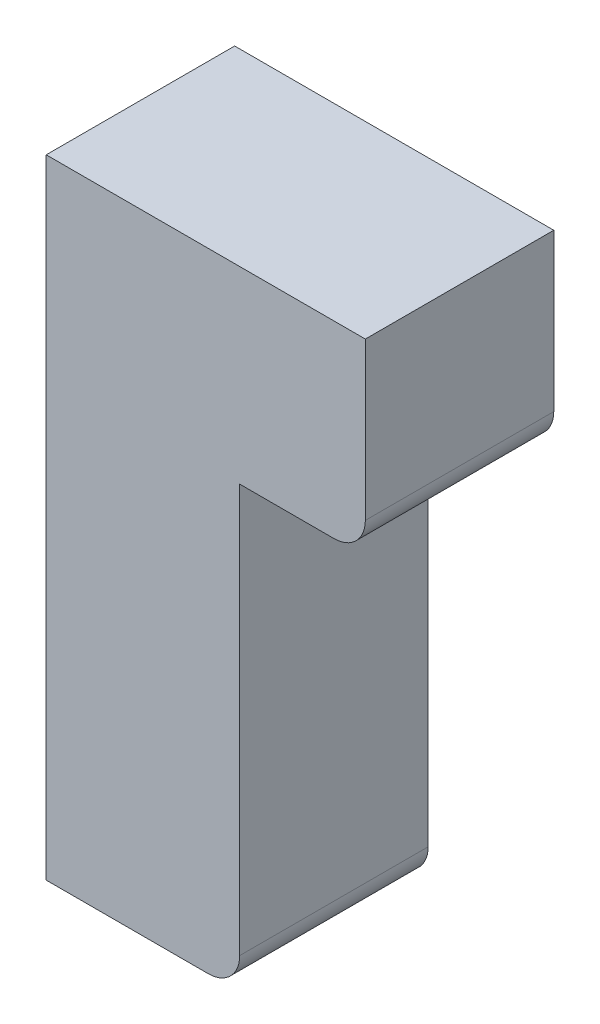
ISO-10303-21;
HEADER;
FILE_DESCRIPTION(('STEP AP214'),'2;1');
FILE_NAME('part.step','',(''),(''),'','','');
FILE_SCHEMA(('AUTOMOTIVE_DESIGN { 1 0 10303 214 1 1 1 1 }'));
ENDSEC;
DATA;
#1=APPLICATION_CONTEXT('core data for automotive mechanical design processes');
#2=APPLICATION_PROTOCOL_DEFINITION('international standard','automotive_design',2000,#1);
#3=PRODUCT_CONTEXT('',#1,'mechanical');
#4=PRODUCT('Part','Part','',(#3));
#5=PRODUCT_RELATED_PRODUCT_CATEGORY('part','',(#4));
#6=PRODUCT_DEFINITION_FORMATION('','',#4);
#7=PRODUCT_DEFINITION_CONTEXT('part definition',#1,'design');
#8=PRODUCT_DEFINITION('design','',#6,#7);
#9=PRODUCT_DEFINITION_SHAPE('','',#8);
#10=(LENGTH_UNIT() NAMED_UNIT(*) SI_UNIT(.MILLI.,.METRE.));
#11=(NAMED_UNIT(*) PLANE_ANGLE_UNIT() SI_UNIT($,.RADIAN.));
#12=(NAMED_UNIT(*) SI_UNIT($,.STERADIAN.) SOLID_ANGLE_UNIT());
#13=UNCERTAINTY_MEASURE_WITH_UNIT(LENGTH_MEASURE(1.E-05),#10,'distance_accuracy_value','');
#14=(GEOMETRIC_REPRESENTATION_CONTEXT(3) GLOBAL_UNCERTAINTY_ASSIGNED_CONTEXT((#13)) GLOBAL_UNIT_ASSIGNED_CONTEXT((#10,
#11,#12)) REPRESENTATION_CONTEXT('',''));
#15=CARTESIAN_POINT('',(0.,0.,0.));
#16=DIRECTION('',(0.,0.,1.));
#17=DIRECTION('',(1.,0.,0.));
#18=AXIS2_PLACEMENT_3D('',#15,#16,#17);
#19=CARTESIAN_POINT('',(-6.44521056215637,-2.8608374283638,3.));
#20=DIRECTION('',(1.,0.,0.));
#21=DIRECTION('',(0.,0.,-1.));
#22=AXIS2_PLACEMENT_3D('',#19,#20,#21);
#23=PLANE('',#22);
#24=DIRECTION('',(0.,-1.,0.));
#25=VECTOR('',#24,1.);
#26=CARTESIAN_POINT('',(-6.44521056215637,-2.8608374283638,0.));
#27=LINE('',#26,#25);
#28=CARTESIAN_POINT('',(-6.44521056215637,7.1391625716362,0.));
#29=VERTEX_POINT('',#28);
#30=CARTESIAN_POINT('',(-6.44521056215637,-2.8608374283638,0.));
#31=VERTEX_POINT('',#30);
#32=EDGE_CURVE('E122',#29,#31,#27,.T.);
#33=ORIENTED_EDGE('',*,*,#32,.T.);
#34=DIRECTION('',(0.,0.,-1.));
#35=VECTOR('',#34,1.);
#36=CARTESIAN_POINT('',(-6.44521056215637,-2.8608374283638,3.));
#37=LINE('',#36,#35);
#38=CARTESIAN_POINT('',(-6.44521056215637,-2.8608374283638,3.));
#39=VERTEX_POINT('',#38);
#40=EDGE_CURVE('E103',#39,#31,#37,.T.);
#41=ORIENTED_EDGE('',*,*,#40,.F.);
#42=DIRECTION('',(0.,-1.,0.));
#43=VECTOR('',#42,1.);
#44=CARTESIAN_POINT('',(-6.44521056215637,-2.8608374283638,3.));
#45=LINE('',#44,#43);
#46=CARTESIAN_POINT('',(-6.44521056215637,7.1391625716362,3.));
#47=VERTEX_POINT('',#46);
#48=EDGE_CURVE('E110',#47,#39,#45,.T.);
#49=ORIENTED_EDGE('',*,*,#48,.F.);
#50=DIRECTION('',(0.,0.,-1.));
#51=VECTOR('',#50,1.);
#52=CARTESIAN_POINT('',(-6.44521056215637,7.1391625716362,3.));
#53=LINE('',#52,#51);
#54=EDGE_CURVE('E160',#47,#29,#53,.T.);
#55=ORIENTED_EDGE('',*,*,#54,.T.);
#56=EDGE_LOOP('',(#33,#41,#49,#55));
#57=FACE_BOUND('',#56,.T.);
#58=ADVANCED_FACE('F33',(#57),#23,.F.);
#59=CARTESIAN_POINT('',(-3.36521056215637,-2.8608374283638,3.));
#60=DIRECTION('',(0.,1.,0.));
#61=DIRECTION('',(0.,0.,1.));
#62=AXIS2_PLACEMENT_3D('',#59,#60,#61);
#63=PLANE('',#62);
#64=DIRECTION('',(1.,0.,0.));
#65=VECTOR('',#64,1.);
#66=CARTESIAN_POINT('',(-3.36521056215637,-2.8608374283638,0.));
#67=LINE('',#66,#65);
#68=CARTESIAN_POINT('',(-3.86521056215637,-2.8608374283638,0.));
#69=VERTEX_POINT('',#68);
#70=EDGE_CURVE('E169',#31,#69,#67,.T.);
#71=ORIENTED_EDGE('',*,*,#70,.T.);
#72=DIRECTION('',(0.,0.,-1.));
#73=VECTOR('',#72,1.);
#74=CARTESIAN_POINT('',(-3.86521056215637,-2.8608374283638,3.));
#75=LINE('',#74,#73);
#76=CARTESIAN_POINT('',(-3.86521056215637,-2.8608374283638,3.));
#77=VERTEX_POINT('',#76);
#78=EDGE_CURVE('E106',#69,#77,#75,.F.);
#79=ORIENTED_EDGE('',*,*,#78,.T.);
#80=DIRECTION('',(1.,0.,0.));
#81=VECTOR('',#80,1.);
#82=CARTESIAN_POINT('',(-3.36521056215637,-2.8608374283638,3.));
#83=LINE('',#82,#81);
#84=EDGE_CURVE('E98',#39,#77,#83,.T.);
#85=ORIENTED_EDGE('',*,*,#84,.F.);
#86=ORIENTED_EDGE('',*,*,#40,.T.);
#87=EDGE_LOOP('',(#71,#79,#85,#86));
#88=FACE_BOUND('',#87,.T.);
#89=ADVANCED_FACE('F101',(#88),#63,.F.);
#90=CARTESIAN_POINT('',(-3.36521056215637,4.1391625716362,3.));
#91=DIRECTION('',(-1.,0.,0.));
#92=DIRECTION('',(0.,-1.,0.));
#93=AXIS2_PLACEMENT_3D('',#90,#91,#92);
#94=PLANE('',#93);
#95=DIRECTION('',(0.,1.,0.));
#96=VECTOR('',#95,1.);
#97=CARTESIAN_POINT('',(-3.36521056215637,4.1391625716362,3.));
#98=LINE('',#97,#96);
#99=CARTESIAN_POINT('',(-3.36521056215637,-2.3608374283638,3.));
#100=VERTEX_POINT('',#99);
#101=CARTESIAN_POINT('',(-3.36521056215637,4.1391625716362,3.));
#102=VERTEX_POINT('',#101);
#103=EDGE_CURVE('E109',#100,#102,#98,.T.);
#104=ORIENTED_EDGE('',*,*,#103,.F.);
#105=DIRECTION('',(0.,0.,-1.));
#106=VECTOR('',#105,1.);
#107=CARTESIAN_POINT('',(-3.36521056215637,-2.3608374283638,3.));
#108=LINE('',#107,#106);
#109=CARTESIAN_POINT('',(-3.36521056215637,-2.3608374283638,0.));
#110=VERTEX_POINT('',#109);
#111=EDGE_CURVE('E123',#100,#110,#108,.T.);
#112=ORIENTED_EDGE('',*,*,#111,.T.);
#113=DIRECTION('',(0.,1.,0.));
#114=VECTOR('',#113,1.);
#115=CARTESIAN_POINT('',(-3.36521056215637,4.1391625716362,0.));
#116=LINE('',#115,#114);
#117=CARTESIAN_POINT('',(-3.36521056215637,4.1391625716362,0.));
#118=VERTEX_POINT('',#117);
#119=EDGE_CURVE('E156',#110,#118,#116,.T.);
#120=ORIENTED_EDGE('',*,*,#119,.T.);
#121=DIRECTION('',(0.,0.,-1.));
#122=VECTOR('',#121,1.);
#123=CARTESIAN_POINT('',(-3.36521056215637,4.1391625716362,3.));
#124=LINE('',#123,#122);
#125=EDGE_CURVE('E124',#102,#118,#124,.T.);
#126=ORIENTED_EDGE('',*,*,#125,.F.);
#127=EDGE_LOOP('',(#104,#112,#120,#126));
#128=FACE_BOUND('',#127,.T.);
#129=ADVANCED_FACE('F174',(#128),#94,.F.);
#130=CARTESIAN_POINT('',(-1.36521056215637,4.1391625716362,3.));
#131=DIRECTION('',(0.,1.,0.));
#132=DIRECTION('',(0.,0.,1.));
#133=AXIS2_PLACEMENT_3D('',#130,#131,#132);
#134=PLANE('',#133);
#135=DIRECTION('',(1.,0.,0.));
#136=VECTOR('',#135,1.);
#137=CARTESIAN_POINT('',(-1.36521056215637,4.1391625716362,0.));
#138=LINE('',#137,#136);
#139=CARTESIAN_POINT('',(-1.86521056215637,4.1391625716362,0.));
#140=VERTEX_POINT('',#139);
#141=EDGE_CURVE('E153',#118,#140,#138,.T.);
#142=ORIENTED_EDGE('',*,*,#141,.T.);
#143=DIRECTION('',(0.,0.,-1.));
#144=VECTOR('',#143,1.);
#145=CARTESIAN_POINT('',(-1.86521056215637,4.1391625716362,3.));
#146=LINE('',#145,#144);
#147=CARTESIAN_POINT('',(-1.86521056215637,4.1391625716362,3.));
#148=VERTEX_POINT('',#147);
#149=EDGE_CURVE('E41',#140,#148,#146,.F.);
#150=ORIENTED_EDGE('',*,*,#149,.T.);
#151=DIRECTION('',(1.,0.,0.));
#152=VECTOR('',#151,1.);
#153=CARTESIAN_POINT('',(-1.36521056215637,4.1391625716362,3.));
#154=LINE('',#153,#152);
#155=EDGE_CURVE('E164',#102,#148,#154,.T.);
#156=ORIENTED_EDGE('',*,*,#155,.F.);
#157=ORIENTED_EDGE('',*,*,#125,.T.);
#158=EDGE_LOOP('',(#142,#150,#156,#157));
#159=FACE_BOUND('',#158,.T.);
#160=ADVANCED_FACE('F176',(#159),#134,.F.);
#161=CARTESIAN_POINT('',(-1.36521056215637,7.1391625716362,3.));
#162=DIRECTION('',(-1.,0.,0.));
#163=DIRECTION('',(0.,-1.,0.));
#164=AXIS2_PLACEMENT_3D('',#161,#162,#163);
#165=PLANE('',#164);
#166=DIRECTION('',(0.,1.,0.));
#167=VECTOR('',#166,1.);
#168=CARTESIAN_POINT('',(-1.36521056215637,7.1391625716362,3.));
#169=LINE('',#168,#167);
#170=CARTESIAN_POINT('',(-1.36521056215637,4.6391625716362,3.));
#171=VERTEX_POINT('',#170);
#172=CARTESIAN_POINT('',(-1.36521056215637,7.1391625716362,3.));
#173=VERTEX_POINT('',#172);
#174=EDGE_CURVE('E148',#171,#173,#169,.T.);
#175=ORIENTED_EDGE('',*,*,#174,.F.);
#176=DIRECTION('',(0.,0.,-1.));
#177=VECTOR('',#176,1.);
#178=CARTESIAN_POINT('',(-1.36521056215637,4.6391625716362,3.));
#179=LINE('',#178,#177);
#180=CARTESIAN_POINT('',(-1.36521056215637,4.6391625716362,0.));
#181=VERTEX_POINT('',#180);
#182=EDGE_CURVE('E138',#171,#181,#179,.T.);
#183=ORIENTED_EDGE('',*,*,#182,.T.);
#184=DIRECTION('',(0.,1.,0.));
#185=VECTOR('',#184,1.);
#186=CARTESIAN_POINT('',(-1.36521056215637,7.1391625716362,0.));
#187=LINE('',#186,#185);
#188=CARTESIAN_POINT('',(-1.36521056215637,7.1391625716362,0.));
#189=VERTEX_POINT('',#188);
#190=EDGE_CURVE('E146',#181,#189,#187,.T.);
#191=ORIENTED_EDGE('',*,*,#190,.T.);
#192=DIRECTION('',(0.,0.,-1.));
#193=VECTOR('',#192,1.);
#194=CARTESIAN_POINT('',(-1.36521056215637,7.1391625716362,3.));
#195=LINE('',#194,#193);
#196=EDGE_CURVE('E130',#173,#189,#195,.T.);
#197=ORIENTED_EDGE('',*,*,#196,.F.);
#198=EDGE_LOOP('',(#175,#183,#191,#197));
#199=FACE_BOUND('',#198,.T.);
#200=ADVANCED_FACE('F144',(#199),#165,.F.);
#201=CARTESIAN_POINT('',(-6.44521056215637,7.1391625716362,3.));
#202=DIRECTION('',(0.,-1.,0.));
#203=DIRECTION('',(0.,0.,-1.));
#204=AXIS2_PLACEMENT_3D('',#201,#202,#203);
#205=PLANE('',#204);
#206=DIRECTION('',(-1.,0.,0.));
#207=VECTOR('',#206,1.);
#208=CARTESIAN_POINT('',(-6.44521056215637,7.1391625716362,0.));
#209=LINE('',#208,#207);
#210=EDGE_CURVE('E119',#189,#29,#209,.T.);
#211=ORIENTED_EDGE('',*,*,#210,.T.);
#212=ORIENTED_EDGE('',*,*,#54,.F.);
#213=DIRECTION('',(-1.,0.,0.));
#214=VECTOR('',#213,1.);
#215=CARTESIAN_POINT('',(-6.44521056215637,7.1391625716362,3.));
#216=LINE('',#215,#214);
#217=EDGE_CURVE('E115',#173,#47,#216,.T.);
#218=ORIENTED_EDGE('',*,*,#217,.F.);
#219=ORIENTED_EDGE('',*,*,#196,.T.);
#220=EDGE_LOOP('',(#211,#212,#218,#219));
#221=FACE_BOUND('',#220,.T.);
#222=ADVANCED_FACE('F162',(#221),#205,.F.);
#223=CARTESIAN_POINT('',(0.,0.,3.));
#224=DIRECTION('',(0.,0.,-1.));
#225=DIRECTION('',(-1.,0.,0.));
#226=AXIS2_PLACEMENT_3D('',#223,#224,#225);
#227=PLANE('',#226);
#228=ORIENTED_EDGE('',*,*,#155,.T.);
#229=CARTESIAN_POINT('',(-1.86521056215637,4.6391625716362,3.));
#230=DIRECTION('',(0.,0.,-1.));
#231=DIRECTION('',(-1.,0.,0.));
#232=AXIS2_PLACEMENT_3D('',#229,#230,#231);
#233=CIRCLE('',#232,0.5);
#234=EDGE_CURVE('E11',#148,#171,#233,.F.);
#235=ORIENTED_EDGE('',*,*,#234,.T.);
#236=ORIENTED_EDGE('',*,*,#174,.T.);
#237=ORIENTED_EDGE('',*,*,#217,.T.);
#238=ORIENTED_EDGE('',*,*,#48,.T.);
#239=ORIENTED_EDGE('',*,*,#84,.T.);
#240=CARTESIAN_POINT('',(-3.86521056215637,-2.3608374283638,3.));
#241=DIRECTION('',(0.,0.,-1.));
#242=DIRECTION('',(-1.,0.,0.));
#243=AXIS2_PLACEMENT_3D('',#240,#241,#242);
#244=CIRCLE('',#243,0.5);
#245=EDGE_CURVE('E136',#77,#100,#244,.F.);
#246=ORIENTED_EDGE('',*,*,#245,.T.);
#247=ORIENTED_EDGE('',*,*,#103,.T.);
#248=EDGE_LOOP('',(#228,#235,#236,#237,#238,#239,#246,#247));
#249=FACE_BOUND('',#248,.T.);
#250=ADVANCED_FACE('F113',(#249),#227,.F.);
#251=CARTESIAN_POINT('',(0.,0.,0.));
#252=DIRECTION('',(0.,0.,-1.));
#253=DIRECTION('',(-1.,0.,0.));
#254=AXIS2_PLACEMENT_3D('',#251,#252,#253);
#255=PLANE('',#254);
#256=ORIENTED_EDGE('',*,*,#190,.F.);
#257=CARTESIAN_POINT('',(-1.86521056215637,4.6391625716362,0.));
#258=DIRECTION('',(0.,0.,-1.));
#259=DIRECTION('',(-1.,0.,0.));
#260=AXIS2_PLACEMENT_3D('',#257,#258,#259);
#261=CIRCLE('',#260,0.5);
#262=EDGE_CURVE('E55',#181,#140,#261,.T.);
#263=ORIENTED_EDGE('',*,*,#262,.T.);
#264=ORIENTED_EDGE('',*,*,#141,.F.);
#265=ORIENTED_EDGE('',*,*,#119,.F.);
#266=CARTESIAN_POINT('',(-3.86521056215637,-2.3608374283638,0.));
#267=DIRECTION('',(0.,0.,-1.));
#268=DIRECTION('',(-1.,0.,0.));
#269=AXIS2_PLACEMENT_3D('',#266,#267,#268);
#270=CIRCLE('',#269,0.5);
#271=EDGE_CURVE('E127',#110,#69,#270,.T.);
#272=ORIENTED_EDGE('',*,*,#271,.T.);
#273=ORIENTED_EDGE('',*,*,#70,.F.);
#274=ORIENTED_EDGE('',*,*,#32,.F.);
#275=ORIENTED_EDGE('',*,*,#210,.F.);
#276=EDGE_LOOP('',(#256,#263,#264,#265,#272,#273,#274,#275));
#277=FACE_BOUND('',#276,.T.);
#278=ADVANCED_FACE('F152',(#277),#255,.T.);
#279=CARTESIAN_POINT('',(-3.86521056215637,-2.3608374283638,3.));
#280=DIRECTION('',(0.,0.,-1.));
#281=DIRECTION('',(-1.,0.,0.));
#282=AXIS2_PLACEMENT_3D('',#279,#280,#281);
#283=CYLINDRICAL_SURFACE('',#282,0.5);
#284=ORIENTED_EDGE('',*,*,#245,.F.);
#285=ORIENTED_EDGE('',*,*,#78,.F.);
#286=ORIENTED_EDGE('',*,*,#271,.F.);
#287=ORIENTED_EDGE('',*,*,#111,.F.);
#288=EDGE_LOOP('',(#284,#285,#286,#287));
#289=FACE_BOUND('',#288,.T.);
#290=ADVANCED_FACE('F179',(#289),#283,.T.);
#291=CARTESIAN_POINT('',(-1.86521056215637,4.6391625716362,3.));
#292=DIRECTION('',(0.,0.,-1.));
#293=DIRECTION('',(-1.,0.,0.));
#294=AXIS2_PLACEMENT_3D('',#291,#292,#293);
#295=CYLINDRICAL_SURFACE('',#294,0.5);
#296=ORIENTED_EDGE('',*,*,#234,.F.);
#297=ORIENTED_EDGE('',*,*,#149,.F.);
#298=ORIENTED_EDGE('',*,*,#262,.F.);
#299=ORIENTED_EDGE('',*,*,#182,.F.);
#300=EDGE_LOOP('',(#296,#297,#298,#299));
#301=FACE_BOUND('',#300,.T.);
#302=ADVANCED_FACE('F35',(#301),#295,.T.);
#303=CLOSED_SHELL('',(#58,#89,#129,#160,#200,#222,#250,#278,#290,#302));
#304=MANIFOLD_SOLID_BREP('B2',#303);
#305=ADVANCED_BREP_SHAPE_REPRESENTATION('',(#18,#304),#14);
#306=SHAPE_DEFINITION_REPRESENTATION(#9,#305);
ENDSEC;
END-ISO-10303-21;
